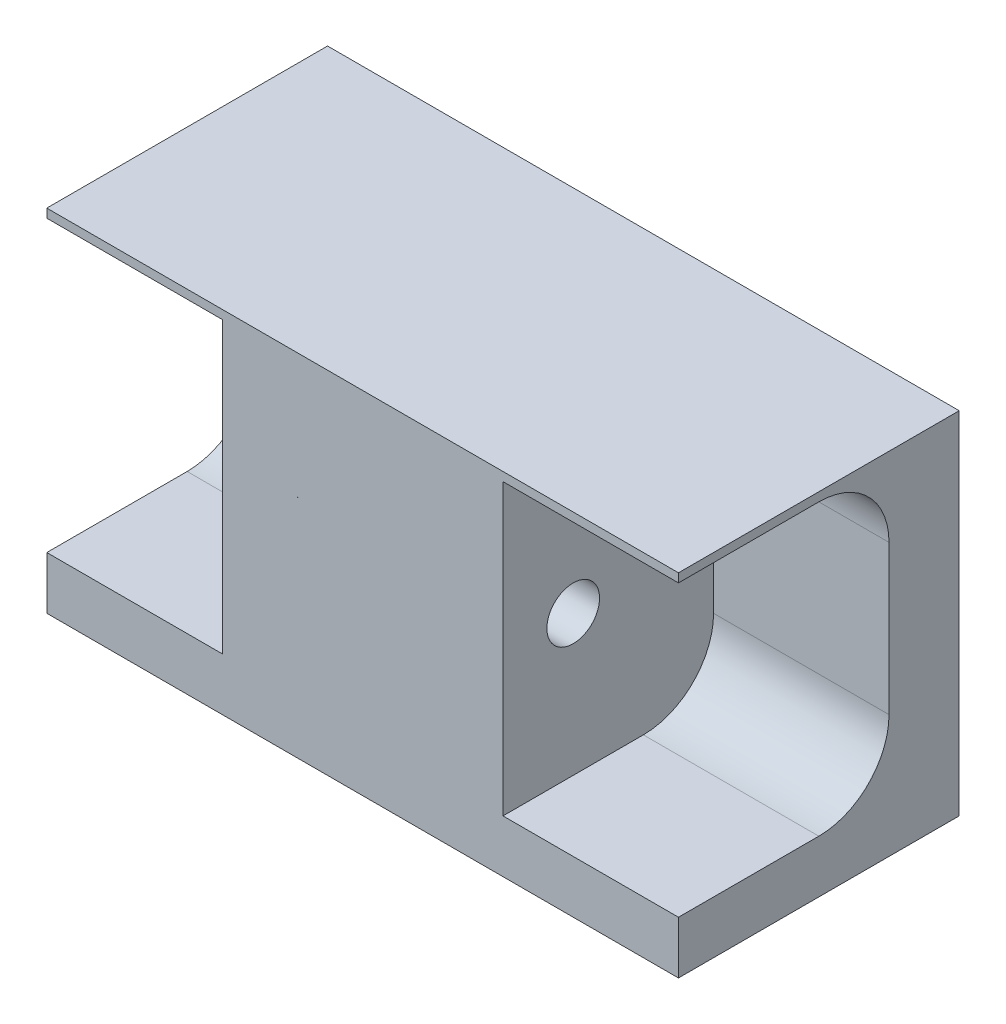
ISO-10303-21;
HEADER;
FILE_DESCRIPTION(('STEP AP214'),'2;1');
FILE_NAME('part.step','',(''),(''),'','','');
FILE_SCHEMA(('AUTOMOTIVE_DESIGN { 1 0 10303 214 1 1 1 1 }'));
ENDSEC;
DATA;
#1=APPLICATION_CONTEXT('core data for automotive mechanical design processes');
#2=APPLICATION_PROTOCOL_DEFINITION('international standard','automotive_design',2000,#1);
#3=PRODUCT_CONTEXT('',#1,'mechanical');
#4=PRODUCT('Part','Part','',(#3));
#5=PRODUCT_RELATED_PRODUCT_CATEGORY('part','',(#4));
#6=PRODUCT_DEFINITION_FORMATION('','',#4);
#7=PRODUCT_DEFINITION_CONTEXT('part definition',#1,'design');
#8=PRODUCT_DEFINITION('design','',#6,#7);
#9=PRODUCT_DEFINITION_SHAPE('','',#8);
#10=(LENGTH_UNIT() NAMED_UNIT(*) SI_UNIT(.MILLI.,.METRE.));
#11=(NAMED_UNIT(*) PLANE_ANGLE_UNIT() SI_UNIT($,.RADIAN.));
#12=(NAMED_UNIT(*) SI_UNIT($,.STERADIAN.) SOLID_ANGLE_UNIT());
#13=UNCERTAINTY_MEASURE_WITH_UNIT(LENGTH_MEASURE(1.E-05),#10,'distance_accuracy_value','');
#14=(GEOMETRIC_REPRESENTATION_CONTEXT(3) GLOBAL_UNCERTAINTY_ASSIGNED_CONTEXT((#13)) GLOBAL_UNIT_ASSIGNED_CONTEXT((#10,
#11,#12)) REPRESENTATION_CONTEXT('',''));
#15=CARTESIAN_POINT('',(0.,0.,0.));
#16=DIRECTION('',(0.,0.,1.));
#17=DIRECTION('',(1.,0.,0.));
#18=AXIS2_PLACEMENT_3D('',#15,#16,#17);
#19=CARTESIAN_POINT('',(114.3,127.,-101.6));
#20=DIRECTION('',(0.,0.,1.));
#21=DIRECTION('',(0.,-1.,0.));
#22=AXIS2_PLACEMENT_3D('',#19,#20,#21);
#23=PLANE('',#22);
#24=DIRECTION('',(-1.,0.,0.));
#25=VECTOR('',#24,1.);
#26=CARTESIAN_POINT('',(114.3,-127.,-101.6));
#27=LINE('',#26,#25);
#28=CARTESIAN_POINT('',(114.3,-127.,-101.6));
#29=VERTEX_POINT('',#28);
#30=CARTESIAN_POINT('',(-342.9,-127.,-101.6));
#31=VERTEX_POINT('',#30);
#32=EDGE_CURVE('E270',#29,#31,#27,.T.);
#33=ORIENTED_EDGE('',*,*,#32,.T.);
#34=DIRECTION('',(0.,1.,0.));
#35=VECTOR('',#34,1.);
#36=CARTESIAN_POINT('',(-342.9,127.,-101.6));
#37=LINE('',#36,#35);
#38=CARTESIAN_POINT('',(-342.9,127.,-101.6));
#39=VERTEX_POINT('',#38);
#40=EDGE_CURVE('E199',#31,#39,#37,.T.);
#41=ORIENTED_EDGE('',*,*,#40,.T.);
#42=DIRECTION('',(-1.,0.,0.));
#43=VECTOR('',#42,1.);
#44=CARTESIAN_POINT('',(114.3,127.,-101.6));
#45=LINE('',#44,#43);
#46=CARTESIAN_POINT('',(114.3,127.,-101.6));
#47=VERTEX_POINT('',#46);
#48=EDGE_CURVE('E11',#47,#39,#45,.T.);
#49=ORIENTED_EDGE('',*,*,#48,.F.);
#50=DIRECTION('',(0.,1.,0.));
#51=VECTOR('',#50,1.);
#52=CARTESIAN_POINT('',(114.3,127.,-101.6));
#53=LINE('',#52,#51);
#54=EDGE_CURVE('E252',#29,#47,#53,.T.);
#55=ORIENTED_EDGE('',*,*,#54,.F.);
#56=EDGE_LOOP('',(#33,#41,#49,#55));
#57=FACE_BOUND('',#56,.T.);
#58=ADVANCED_FACE('F34',(#57),#23,.F.);
#59=CARTESIAN_POINT('',(114.3,127.,101.6));
#60=DIRECTION('',(0.,-1.,0.));
#61=DIRECTION('',(0.,0.,-1.));
#62=AXIS2_PLACEMENT_3D('',#59,#60,#61);
#63=PLANE('',#62);
#64=ORIENTED_EDGE('',*,*,#48,.T.);
#65=DIRECTION('',(0.,0.,1.));
#66=VECTOR('',#65,1.);
#67=CARTESIAN_POINT('',(-342.9,127.,101.6));
#68=LINE('',#67,#66);
#69=CARTESIAN_POINT('',(-342.9,127.,101.6));
#70=VERTEX_POINT('',#69);
#71=EDGE_CURVE('E209',#39,#70,#68,.T.);
#72=ORIENTED_EDGE('',*,*,#71,.T.);
#73=DIRECTION('',(-1.,0.,0.));
#74=VECTOR('',#73,1.);
#75=CARTESIAN_POINT('',(114.3,127.,101.6));
#76=LINE('',#75,#74);
#77=CARTESIAN_POINT('',(114.3,127.,101.6));
#78=VERTEX_POINT('',#77);
#79=EDGE_CURVE('E42',#78,#70,#76,.T.);
#80=ORIENTED_EDGE('',*,*,#79,.F.);
#81=DIRECTION('',(0.,0.,1.));
#82=VECTOR('',#81,1.);
#83=CARTESIAN_POINT('',(114.3,127.,101.6));
#84=LINE('',#83,#82);
#85=EDGE_CURVE('E263',#47,#78,#84,.T.);
#86=ORIENTED_EDGE('',*,*,#85,.F.);
#87=EDGE_LOOP('',(#64,#72,#80,#86));
#88=FACE_BOUND('',#87,.T.);
#89=ADVANCED_FACE('F283',(#88),#63,.F.);
#90=CARTESIAN_POINT('',(114.3,127.,101.6));
#91=DIRECTION('',(0.,0.,-1.));
#92=DIRECTION('',(0.,1.,0.));
#93=AXIS2_PLACEMENT_3D('',#90,#91,#92);
#94=PLANE('',#93);
#95=DIRECTION('',(0.,-1.,0.));
#96=VECTOR('',#95,1.);
#97=CARTESIAN_POINT('',(-12.7,120.65,101.6));
#98=LINE('',#97,#96);
#99=CARTESIAN_POINT('',(-12.7,120.65,101.6));
#100=VERTEX_POINT('',#99);
#101=CARTESIAN_POINT('',(-12.7,-88.9,101.6));
#102=VERTEX_POINT('',#101);
#103=EDGE_CURVE('E219',#100,#102,#98,.T.);
#104=ORIENTED_EDGE('',*,*,#103,.F.);
#105=DIRECTION('',(1.,0.,0.));
#106=VECTOR('',#105,1.);
#107=CARTESIAN_POINT('',(-12.7,120.65,101.6));
#108=LINE('',#107,#106);
#109=CARTESIAN_POINT('',(114.3,120.65,101.6));
#110=VERTEX_POINT('',#109);
#111=EDGE_CURVE('E249',#100,#110,#108,.T.);
#112=ORIENTED_EDGE('',*,*,#111,.T.);
#113=DIRECTION('',(0.,-1.,0.));
#114=VECTOR('',#113,1.);
#115=CARTESIAN_POINT('',(114.3,127.,101.6));
#116=LINE('',#115,#114);
#117=EDGE_CURVE('E266',#78,#110,#116,.T.);
#118=ORIENTED_EDGE('',*,*,#117,.F.);
#119=ORIENTED_EDGE('',*,*,#79,.T.);
#120=DIRECTION('',(0.,-1.,0.));
#121=VECTOR('',#120,1.);
#122=CARTESIAN_POINT('',(-342.9,127.,101.6));
#123=LINE('',#122,#121);
#124=CARTESIAN_POINT('',(-342.9,120.65,101.6));
#125=VERTEX_POINT('',#124);
#126=EDGE_CURVE('E213',#70,#125,#123,.T.);
#127=ORIENTED_EDGE('',*,*,#126,.T.);
#128=DIRECTION('',(-1.,0.,0.));
#129=VECTOR('',#128,1.);
#130=CARTESIAN_POINT('',(-215.9,120.65,101.6));
#131=LINE('',#130,#129);
#132=CARTESIAN_POINT('',(-215.9,120.65,101.6));
#133=VERTEX_POINT('',#132);
#134=EDGE_CURVE('E175',#133,#125,#131,.T.);
#135=ORIENTED_EDGE('',*,*,#134,.F.);
#136=DIRECTION('',(0.,-1.,0.));
#137=VECTOR('',#136,1.);
#138=CARTESIAN_POINT('',(-215.9,120.65,101.6));
#139=LINE('',#138,#137);
#140=CARTESIAN_POINT('',(-215.9,-88.9,101.6));
#141=VERTEX_POINT('',#140);
#142=EDGE_CURVE('E153',#133,#141,#139,.T.);
#143=ORIENTED_EDGE('',*,*,#142,.T.);
#144=DIRECTION('',(-1.,0.,0.));
#145=VECTOR('',#144,1.);
#146=CARTESIAN_POINT('',(-215.9,-88.9,101.6));
#147=LINE('',#146,#145);
#148=CARTESIAN_POINT('',(-342.9,-88.9,101.6));
#149=VERTEX_POINT('',#148);
#150=EDGE_CURVE('E160',#141,#149,#147,.T.);
#151=ORIENTED_EDGE('',*,*,#150,.T.);
#152=CARTESIAN_POINT('',(-342.9,-127.,101.6));
#153=VERTEX_POINT('',#152);
#154=EDGE_CURVE('E212',#149,#153,#123,.T.);
#155=ORIENTED_EDGE('',*,*,#154,.T.);
#156=DIRECTION('',(-1.,0.,0.));
#157=VECTOR('',#156,1.);
#158=CARTESIAN_POINT('',(114.3,-127.,101.6));
#159=LINE('',#158,#157);
#160=CARTESIAN_POINT('',(114.3,-127.,101.6));
#161=VERTEX_POINT('',#160);
#162=EDGE_CURVE('E272',#161,#153,#159,.T.);
#163=ORIENTED_EDGE('',*,*,#162,.F.);
#164=CARTESIAN_POINT('',(114.3,-88.9,101.6));
#165=VERTEX_POINT('',#164);
#166=EDGE_CURVE('E265',#165,#161,#116,.T.);
#167=ORIENTED_EDGE('',*,*,#166,.F.);
#168=DIRECTION('',(1.,0.,0.));
#169=VECTOR('',#168,1.);
#170=CARTESIAN_POINT('',(-12.7,-88.9,101.6));
#171=LINE('',#170,#169);
#172=EDGE_CURVE('E49',#102,#165,#171,.T.);
#173=ORIENTED_EDGE('',*,*,#172,.F.);
#174=EDGE_LOOP('',(#104,#112,#118,#119,#127,#135,#143,#151,#155,#163,#167,#173));
#175=FACE_BOUND('',#174,.T.);
#176=ADVANCED_FACE('F172',(#175),#94,.F.);
#177=CARTESIAN_POINT('',(114.3,-127.,101.6));
#178=DIRECTION('',(0.,1.,0.));
#179=DIRECTION('',(0.,0.,1.));
#180=AXIS2_PLACEMENT_3D('',#177,#178,#179);
#181=PLANE('',#180);
#182=ORIENTED_EDGE('',*,*,#162,.T.);
#183=DIRECTION('',(0.,0.,-1.));
#184=VECTOR('',#183,1.);
#185=CARTESIAN_POINT('',(-342.9,-127.,101.6));
#186=LINE('',#185,#184);
#187=EDGE_CURVE('E215',#153,#31,#186,.T.);
#188=ORIENTED_EDGE('',*,*,#187,.T.);
#189=ORIENTED_EDGE('',*,*,#32,.F.);
#190=DIRECTION('',(0.,0.,-1.));
#191=VECTOR('',#190,1.);
#192=CARTESIAN_POINT('',(114.3,-127.,101.6));
#193=LINE('',#192,#191);
#194=EDGE_CURVE('E57',#161,#29,#193,.T.);
#195=ORIENTED_EDGE('',*,*,#194,.F.);
#196=EDGE_LOOP('',(#182,#188,#189,#195));
#197=FACE_BOUND('',#196,.T.);
#198=ADVANCED_FACE('F291',(#197),#181,.F.);
#199=CARTESIAN_POINT('',(114.3,0.,0.));
#200=DIRECTION('',(1.,0.,0.));
#201=DIRECTION('',(0.,0.,-1.));
#202=AXIS2_PLACEMENT_3D('',#199,#200,#201);
#203=PLANE('',#202);
#204=DIRECTION('',(0.,0.,1.));
#205=VECTOR('',#204,1.);
#206=CARTESIAN_POINT('',(114.3,120.65,101.6));
#207=LINE('',#206,#205);
#208=CARTESIAN_POINT('',(114.3,120.65,3.40005801291454E-13));
#209=VERTEX_POINT('',#208);
#210=EDGE_CURVE('E223',#209,#110,#207,.T.);
#211=ORIENTED_EDGE('',*,*,#210,.F.);
#212=CARTESIAN_POINT('',(114.3,69.85,0.));
#213=DIRECTION('',(1.,0.,0.));
#214=DIRECTION('',(0.,0.,1.));
#215=AXIS2_PLACEMENT_3D('',#212,#213,#214);
#216=CIRCLE('',#215,50.8);
#217=CARTESIAN_POINT('',(114.3,69.8499999999997,-50.8));
#218=VERTEX_POINT('',#217);
#219=EDGE_CURVE('E245',#218,#209,#216,.T.);
#220=ORIENTED_EDGE('',*,*,#219,.F.);
#221=DIRECTION('',(0.,1.,0.));
#222=VECTOR('',#221,1.);
#223=CARTESIAN_POINT('',(114.3,69.8499999999997,-50.8));
#224=LINE('',#223,#222);
#225=CARTESIAN_POINT('',(114.3,-38.0999999999997,-50.8));
#226=VERTEX_POINT('',#225);
#227=EDGE_CURVE('E242',#226,#218,#224,.T.);
#228=ORIENTED_EDGE('',*,*,#227,.F.);
#229=CARTESIAN_POINT('',(114.3,-38.1,0.));
#230=DIRECTION('',(1.,0.,0.));
#231=DIRECTION('',(0.,0.,1.));
#232=AXIS2_PLACEMENT_3D('',#229,#230,#231);
#233=CIRCLE('',#232,50.8);
#234=CARTESIAN_POINT('',(114.3,-88.9,3.37746113348814E-13));
#235=VERTEX_POINT('',#234);
#236=EDGE_CURVE('E239',#235,#226,#233,.T.);
#237=ORIENTED_EDGE('',*,*,#236,.F.);
#238=DIRECTION('',(0.,0.,-1.));
#239=VECTOR('',#238,1.);
#240=CARTESIAN_POINT('',(114.3,-88.9,3.33066907387547E-13));
#241=LINE('',#240,#239);
#242=EDGE_CURVE('E218',#165,#235,#241,.T.);
#243=ORIENTED_EDGE('',*,*,#242,.F.);
#244=ORIENTED_EDGE('',*,*,#166,.T.);
#245=ORIENTED_EDGE('',*,*,#194,.T.);
#246=ORIENTED_EDGE('',*,*,#54,.T.);
#247=ORIENTED_EDGE('',*,*,#85,.T.);
#248=ORIENTED_EDGE('',*,*,#117,.T.);
#249=EDGE_LOOP('',(#211,#220,#228,#237,#243,#244,#245,#246,#247,#248));
#250=FACE_BOUND('',#249,.T.);
#251=ADVANCED_FACE('F293',(#250),#203,.T.);
#252=CARTESIAN_POINT('',(-12.7,120.65,101.6));
#253=DIRECTION('',(0.,1.,0.));
#254=DIRECTION('',(0.,0.,1.));
#255=AXIS2_PLACEMENT_3D('',#252,#253,#254);
#256=PLANE('',#255);
#257=ORIENTED_EDGE('',*,*,#210,.T.);
#258=ORIENTED_EDGE('',*,*,#111,.F.);
#259=DIRECTION('',(0.,0.,1.));
#260=VECTOR('',#259,1.);
#261=CARTESIAN_POINT('',(-12.7,120.65,101.6));
#262=LINE('',#261,#260);
#263=CARTESIAN_POINT('',(-12.7,120.65,3.40005801291454E-13));
#264=VERTEX_POINT('',#263);
#265=EDGE_CURVE('E235',#264,#100,#262,.T.);
#266=ORIENTED_EDGE('',*,*,#265,.F.);
#267=DIRECTION('',(1.,0.,0.));
#268=VECTOR('',#267,1.);
#269=CARTESIAN_POINT('',(-12.7,120.65,3.40005801291454E-13));
#270=LINE('',#269,#268);
#271=EDGE_CURVE('E253',#264,#209,#270,.T.);
#272=ORIENTED_EDGE('',*,*,#271,.T.);
#273=EDGE_LOOP('',(#257,#258,#266,#272));
#274=FACE_BOUND('',#273,.T.);
#275=ADVANCED_FACE('F299',(#274),#256,.F.);
#276=CARTESIAN_POINT('',(-12.7,69.85,0.));
#277=DIRECTION('',(1.,0.,0.));
#278=DIRECTION('',(0.,0.,-1.));
#279=AXIS2_PLACEMENT_3D('',#276,#277,#278);
#280=CYLINDRICAL_SURFACE('',#279,50.8);
#281=ORIENTED_EDGE('',*,*,#219,.T.);
#282=ORIENTED_EDGE('',*,*,#271,.F.);
#283=CARTESIAN_POINT('',(-12.7,69.85,0.));
#284=DIRECTION('',(1.,0.,0.));
#285=DIRECTION('',(0.,0.,1.));
#286=AXIS2_PLACEMENT_3D('',#283,#284,#285);
#287=CIRCLE('',#286,50.8);
#288=CARTESIAN_POINT('',(-12.7,69.8499999999997,-50.8));
#289=VERTEX_POINT('',#288);
#290=EDGE_CURVE('E232',#289,#264,#287,.T.);
#291=ORIENTED_EDGE('',*,*,#290,.F.);
#292=DIRECTION('',(1.,0.,0.));
#293=VECTOR('',#292,1.);
#294=CARTESIAN_POINT('',(-12.7,69.8499999999997,-50.8));
#295=LINE('',#294,#293);
#296=EDGE_CURVE('E255',#289,#218,#295,.T.);
#297=ORIENTED_EDGE('',*,*,#296,.T.);
#298=EDGE_LOOP('',(#281,#282,#291,#297));
#299=FACE_BOUND('',#298,.T.);
#300=ADVANCED_FACE('F416',(#299),#280,.F.);
#301=CARTESIAN_POINT('',(-12.7,69.8499999999997,-50.8));
#302=DIRECTION('',(0.,0.,-1.));
#303=DIRECTION('',(0.,1.,0.));
#304=AXIS2_PLACEMENT_3D('',#301,#302,#303);
#305=PLANE('',#304);
#306=ORIENTED_EDGE('',*,*,#227,.T.);
#307=ORIENTED_EDGE('',*,*,#296,.F.);
#308=DIRECTION('',(0.,1.,0.));
#309=VECTOR('',#308,1.);
#310=CARTESIAN_POINT('',(-12.7,69.8499999999997,-50.8));
#311=LINE('',#310,#309);
#312=CARTESIAN_POINT('',(-12.7,-38.0999999999997,-50.8));
#313=VERTEX_POINT('',#312);
#314=EDGE_CURVE('E229',#313,#289,#311,.T.);
#315=ORIENTED_EDGE('',*,*,#314,.F.);
#316=DIRECTION('',(1.,0.,0.));
#317=VECTOR('',#316,1.);
#318=CARTESIAN_POINT('',(-12.7,-38.0999999999997,-50.8));
#319=LINE('',#318,#317);
#320=EDGE_CURVE('E257',#313,#226,#319,.T.);
#321=ORIENTED_EDGE('',*,*,#320,.T.);
#322=EDGE_LOOP('',(#306,#307,#315,#321));
#323=FACE_BOUND('',#322,.T.);
#324=ADVANCED_FACE('F420',(#323),#305,.F.);
#325=CARTESIAN_POINT('',(-12.7,-38.1,0.));
#326=DIRECTION('',(1.,0.,0.));
#327=DIRECTION('',(0.,0.,-1.));
#328=AXIS2_PLACEMENT_3D('',#325,#326,#327);
#329=CYLINDRICAL_SURFACE('',#328,50.8);
#330=ORIENTED_EDGE('',*,*,#236,.T.);
#331=ORIENTED_EDGE('',*,*,#320,.F.);
#332=CARTESIAN_POINT('',(-12.7,-38.1,0.));
#333=DIRECTION('',(1.,0.,0.));
#334=DIRECTION('',(0.,0.,1.));
#335=AXIS2_PLACEMENT_3D('',#332,#333,#334);
#336=CIRCLE('',#335,50.8);
#337=CARTESIAN_POINT('',(-12.7,-88.9,3.37746113348814E-13));
#338=VERTEX_POINT('',#337);
#339=EDGE_CURVE('E226',#338,#313,#336,.T.);
#340=ORIENTED_EDGE('',*,*,#339,.F.);
#341=DIRECTION('',(1.,0.,0.));
#342=VECTOR('',#341,1.);
#343=CARTESIAN_POINT('',(-12.7,-88.9,3.37746113348814E-13));
#344=LINE('',#343,#342);
#345=EDGE_CURVE('E259',#338,#235,#344,.T.);
#346=ORIENTED_EDGE('',*,*,#345,.T.);
#347=EDGE_LOOP('',(#330,#331,#340,#346));
#348=FACE_BOUND('',#347,.T.);
#349=ADVANCED_FACE('F424',(#348),#329,.F.);
#350=CARTESIAN_POINT('',(-12.7,-88.9,3.33066907387547E-13));
#351=DIRECTION('',(0.,-1.,0.));
#352=DIRECTION('',(0.,0.,-1.));
#353=AXIS2_PLACEMENT_3D('',#350,#351,#352);
#354=PLANE('',#353);
#355=ORIENTED_EDGE('',*,*,#242,.T.);
#356=ORIENTED_EDGE('',*,*,#345,.F.);
#357=DIRECTION('',(0.,0.,-1.));
#358=VECTOR('',#357,1.);
#359=CARTESIAN_POINT('',(-12.7,-88.9,3.33066907387547E-13));
#360=LINE('',#359,#358);
#361=EDGE_CURVE('E222',#102,#338,#360,.T.);
#362=ORIENTED_EDGE('',*,*,#361,.F.);
#363=ORIENTED_EDGE('',*,*,#172,.T.);
#364=EDGE_LOOP('',(#355,#356,#362,#363));
#365=FACE_BOUND('',#364,.T.);
#366=ADVANCED_FACE('F386',(#365),#354,.F.);
#367=CARTESIAN_POINT('',(-12.7,-38.1,0.));
#368=DIRECTION('',(-1.,0.,0.));
#369=DIRECTION('',(0.,0.,1.));
#370=AXIS2_PLACEMENT_3D('',#367,#368,#369);
#371=PLANE('',#370);
#372=CARTESIAN_POINT('',(-12.7,12.7,50.8));
#373=DIRECTION('',(-1.,0.,0.));
#374=DIRECTION('',(0.,0.,1.));
#375=AXIS2_PLACEMENT_3D('',#372,#373,#374);
#376=CIRCLE('',#375,19.05);
#377=CARTESIAN_POINT('',(-12.7,12.7,69.85));
#378=VERTEX_POINT('',#377);
#379=EDGE_CURVE('E181',#378,#378,#376,.T.);
#380=ORIENTED_EDGE('',*,*,#379,.T.);
#381=EDGE_LOOP('',(#380));
#382=FACE_BOUND('',#381,.T.);
#383=ORIENTED_EDGE('',*,*,#103,.T.);
#384=ORIENTED_EDGE('',*,*,#361,.T.);
#385=ORIENTED_EDGE('',*,*,#339,.T.);
#386=ORIENTED_EDGE('',*,*,#314,.T.);
#387=ORIENTED_EDGE('',*,*,#290,.T.);
#388=ORIENTED_EDGE('',*,*,#265,.T.);
#389=EDGE_LOOP('',(#383,#384,#385,#386,#387,#388));
#390=FACE_BOUND('',#389,.T.);
#391=ADVANCED_FACE('F328',(#382,#390),#371,.F.);
#392=CARTESIAN_POINT('',(-342.9,0.,0.));
#393=DIRECTION('',(-1.,0.,0.));
#394=DIRECTION('',(0.,0.,-1.));
#395=AXIS2_PLACEMENT_3D('',#392,#393,#394);
#396=PLANE('',#395);
#397=DIRECTION('',(0.,0.,1.));
#398=VECTOR('',#397,1.);
#399=CARTESIAN_POINT('',(-342.9,120.65,101.6));
#400=LINE('',#399,#398);
#401=CARTESIAN_POINT('',(-342.9,120.65,3.40005801291454E-13));
#402=VERTEX_POINT('',#401);
#403=EDGE_CURVE('E176',#402,#125,#400,.T.);
#404=ORIENTED_EDGE('',*,*,#403,.T.);
#405=ORIENTED_EDGE('',*,*,#126,.F.);
#406=ORIENTED_EDGE('',*,*,#71,.F.);
#407=ORIENTED_EDGE('',*,*,#40,.F.);
#408=ORIENTED_EDGE('',*,*,#187,.F.);
#409=ORIENTED_EDGE('',*,*,#154,.F.);
#410=DIRECTION('',(0.,0.,-1.));
#411=VECTOR('',#410,1.);
#412=CARTESIAN_POINT('',(-342.9,-88.9,3.33066907387547E-13));
#413=LINE('',#412,#411);
#414=CARTESIAN_POINT('',(-342.9,-88.9,3.37746113348814E-13));
#415=VERTEX_POINT('',#414);
#416=EDGE_CURVE('E163',#149,#415,#413,.T.);
#417=ORIENTED_EDGE('',*,*,#416,.T.);
#418=CARTESIAN_POINT('',(-342.9,-38.1,0.));
#419=DIRECTION('',(1.,0.,0.));
#420=DIRECTION('',(0.,0.,1.));
#421=AXIS2_PLACEMENT_3D('',#418,#419,#420);
#422=CIRCLE('',#421,50.8);
#423=CARTESIAN_POINT('',(-342.9,-38.0999999999997,-50.8));
#424=VERTEX_POINT('',#423);
#425=EDGE_CURVE('E190',#415,#424,#422,.T.);
#426=ORIENTED_EDGE('',*,*,#425,.T.);
#427=DIRECTION('',(0.,1.,0.));
#428=VECTOR('',#427,1.);
#429=CARTESIAN_POINT('',(-342.9,69.8499999999997,-50.8));
#430=LINE('',#429,#428);
#431=CARTESIAN_POINT('',(-342.9,69.8499999999997,-50.8));
#432=VERTEX_POINT('',#431);
#433=EDGE_CURVE('E193',#424,#432,#430,.T.);
#434=ORIENTED_EDGE('',*,*,#433,.T.);
#435=CARTESIAN_POINT('',(-342.9,69.85,0.));
#436=DIRECTION('',(1.,0.,0.));
#437=DIRECTION('',(0.,0.,1.));
#438=AXIS2_PLACEMENT_3D('',#435,#436,#437);
#439=CIRCLE('',#438,50.8);
#440=EDGE_CURVE('E178',#432,#402,#439,.T.);
#441=ORIENTED_EDGE('',*,*,#440,.T.);
#442=EDGE_LOOP('',(#404,#405,#406,#407,#408,#409,#417,#426,#434,#441));
#443=FACE_BOUND('',#442,.T.);
#444=ADVANCED_FACE('F280',(#443),#396,.T.);
#445=CARTESIAN_POINT('',(-215.9,120.65,101.6));
#446=DIRECTION('',(0.,1.,0.));
#447=DIRECTION('',(0.,0.,1.));
#448=AXIS2_PLACEMENT_3D('',#445,#446,#447);
#449=PLANE('',#448);
#450=ORIENTED_EDGE('',*,*,#403,.F.);
#451=DIRECTION('',(-1.,0.,0.));
#452=VECTOR('',#451,1.);
#453=CARTESIAN_POINT('',(-215.9,120.65,3.40005801291454E-13));
#454=LINE('',#453,#452);
#455=CARTESIAN_POINT('',(-215.9,120.65,3.40005801291454E-13));
#456=VERTEX_POINT('',#455);
#457=EDGE_CURVE('E200',#456,#402,#454,.T.);
#458=ORIENTED_EDGE('',*,*,#457,.F.);
#459=DIRECTION('',(0.,0.,1.));
#460=VECTOR('',#459,1.);
#461=CARTESIAN_POINT('',(-215.9,120.65,101.6));
#462=LINE('',#461,#460);
#463=EDGE_CURVE('E168',#456,#133,#462,.T.);
#464=ORIENTED_EDGE('',*,*,#463,.T.);
#465=ORIENTED_EDGE('',*,*,#134,.T.);
#466=EDGE_LOOP('',(#450,#458,#464,#465));
#467=FACE_BOUND('',#466,.T.);
#468=ADVANCED_FACE('F327',(#467),#449,.F.);
#469=CARTESIAN_POINT('',(-215.9,69.85,0.));
#470=DIRECTION('',(-1.,0.,0.));
#471=DIRECTION('',(0.,0.,-1.));
#472=AXIS2_PLACEMENT_3D('',#469,#470,#471);
#473=CYLINDRICAL_SURFACE('',#472,50.8);
#474=ORIENTED_EDGE('',*,*,#440,.F.);
#475=DIRECTION('',(-1.,0.,0.));
#476=VECTOR('',#475,1.);
#477=CARTESIAN_POINT('',(-215.9,69.8499999999997,-50.8));
#478=LINE('',#477,#476);
#479=CARTESIAN_POINT('',(-215.9,69.8499999999997,-50.8));
#480=VERTEX_POINT('',#479);
#481=EDGE_CURVE('E202',#480,#432,#478,.T.);
#482=ORIENTED_EDGE('',*,*,#481,.F.);
#483=CARTESIAN_POINT('',(-215.9,69.85,0.));
#484=DIRECTION('',(1.,0.,0.));
#485=DIRECTION('',(0.,0.,1.));
#486=AXIS2_PLACEMENT_3D('',#483,#484,#485);
#487=CIRCLE('',#486,50.8);
#488=EDGE_CURVE('E186',#480,#456,#487,.T.);
#489=ORIENTED_EDGE('',*,*,#488,.T.);
#490=ORIENTED_EDGE('',*,*,#457,.T.);
#491=EDGE_LOOP('',(#474,#482,#489,#490));
#492=FACE_BOUND('',#491,.T.);
#493=ADVANCED_FACE('F338',(#492),#473,.F.);
#494=CARTESIAN_POINT('',(-215.9,69.8499999999997,-50.8));
#495=DIRECTION('',(0.,0.,-1.));
#496=DIRECTION('',(0.,1.,0.));
#497=AXIS2_PLACEMENT_3D('',#494,#495,#496);
#498=PLANE('',#497);
#499=ORIENTED_EDGE('',*,*,#433,.F.);
#500=DIRECTION('',(-1.,0.,0.));
#501=VECTOR('',#500,1.);
#502=CARTESIAN_POINT('',(-215.9,-38.0999999999997,-50.8));
#503=LINE('',#502,#501);
#504=CARTESIAN_POINT('',(-215.9,-38.0999999999997,-50.8));
#505=VERTEX_POINT('',#504);
#506=EDGE_CURVE('E204',#505,#424,#503,.T.);
#507=ORIENTED_EDGE('',*,*,#506,.F.);
#508=DIRECTION('',(0.,1.,0.));
#509=VECTOR('',#508,1.);
#510=CARTESIAN_POINT('',(-215.9,69.8499999999997,-50.8));
#511=LINE('',#510,#509);
#512=EDGE_CURVE('E184',#505,#480,#511,.T.);
#513=ORIENTED_EDGE('',*,*,#512,.T.);
#514=ORIENTED_EDGE('',*,*,#481,.T.);
#515=EDGE_LOOP('',(#499,#507,#513,#514));
#516=FACE_BOUND('',#515,.T.);
#517=ADVANCED_FACE('F348',(#516),#498,.F.);
#518=CARTESIAN_POINT('',(-215.9,-38.1,0.));
#519=DIRECTION('',(-1.,0.,0.));
#520=DIRECTION('',(0.,0.,-1.));
#521=AXIS2_PLACEMENT_3D('',#518,#519,#520);
#522=CYLINDRICAL_SURFACE('',#521,50.8);
#523=ORIENTED_EDGE('',*,*,#425,.F.);
#524=DIRECTION('',(-1.,0.,0.));
#525=VECTOR('',#524,1.);
#526=CARTESIAN_POINT('',(-215.9,-88.9,3.37746113348814E-13));
#527=LINE('',#526,#525);
#528=CARTESIAN_POINT('',(-215.9,-88.9,3.37746113348814E-13));
#529=VERTEX_POINT('',#528);
#530=EDGE_CURVE('E167',#529,#415,#527,.T.);
#531=ORIENTED_EDGE('',*,*,#530,.F.);
#532=CARTESIAN_POINT('',(-215.9,-38.1,0.));
#533=DIRECTION('',(1.,0.,0.));
#534=DIRECTION('',(0.,0.,1.));
#535=AXIS2_PLACEMENT_3D('',#532,#533,#534);
#536=CIRCLE('',#535,50.8);
#537=EDGE_CURVE('E155',#529,#505,#536,.T.);
#538=ORIENTED_EDGE('',*,*,#537,.T.);
#539=ORIENTED_EDGE('',*,*,#506,.T.);
#540=EDGE_LOOP('',(#523,#531,#538,#539));
#541=FACE_BOUND('',#540,.T.);
#542=ADVANCED_FACE('F358',(#541),#522,.F.);
#543=CARTESIAN_POINT('',(-215.9,-88.9,3.33066907387547E-13));
#544=DIRECTION('',(0.,-1.,0.));
#545=DIRECTION('',(0.,0.,-1.));
#546=AXIS2_PLACEMENT_3D('',#543,#544,#545);
#547=PLANE('',#546);
#548=ORIENTED_EDGE('',*,*,#416,.F.);
#549=ORIENTED_EDGE('',*,*,#150,.F.);
#550=DIRECTION('',(0.,0.,-1.));
#551=VECTOR('',#550,1.);
#552=CARTESIAN_POINT('',(-215.9,-88.9,3.33066907387547E-13));
#553=LINE('',#552,#551);
#554=EDGE_CURVE('E148',#141,#529,#553,.T.);
#555=ORIENTED_EDGE('',*,*,#554,.T.);
#556=ORIENTED_EDGE('',*,*,#530,.T.);
#557=EDGE_LOOP('',(#548,#549,#555,#556));
#558=FACE_BOUND('',#557,.T.);
#559=ADVANCED_FACE('F161',(#558),#547,.F.);
#560=CARTESIAN_POINT('',(-215.9,-38.1,0.));
#561=DIRECTION('',(1.,0.,0.));
#562=DIRECTION('',(0.,0.,1.));
#563=AXIS2_PLACEMENT_3D('',#560,#561,#562);
#564=PLANE('',#563);
#565=CARTESIAN_POINT('',(-215.9,12.7,50.8));
#566=DIRECTION('',(1.,0.,0.));
#567=DIRECTION('',(0.,0.,-1.));
#568=AXIS2_PLACEMENT_3D('',#565,#566,#567);
#569=CIRCLE('',#568,19.05);
#570=CARTESIAN_POINT('',(-215.9,12.7,31.75));
#571=VERTEX_POINT('',#570);
#572=EDGE_CURVE('E37',#571,#571,#569,.T.);
#573=ORIENTED_EDGE('',*,*,#572,.T.);
#574=EDGE_LOOP('',(#573));
#575=FACE_BOUND('',#574,.T.);
#576=ORIENTED_EDGE('',*,*,#142,.F.);
#577=ORIENTED_EDGE('',*,*,#463,.F.);
#578=ORIENTED_EDGE('',*,*,#488,.F.);
#579=ORIENTED_EDGE('',*,*,#512,.F.);
#580=ORIENTED_EDGE('',*,*,#537,.F.);
#581=ORIENTED_EDGE('',*,*,#554,.F.);
#582=EDGE_LOOP('',(#576,#577,#578,#579,#580,#581));
#583=FACE_BOUND('',#582,.T.);
#584=ADVANCED_FACE('F150',(#575,#583),#564,.F.);
#585=CARTESIAN_POINT('',(-342.9,12.7,50.8));
#586=DIRECTION('',(1.,0.,0.));
#587=DIRECTION('',(0.,0.,-1.));
#588=AXIS2_PLACEMENT_3D('',#585,#586,#587);
#589=CYLINDRICAL_SURFACE('',#588,19.05);
#590=ORIENTED_EDGE('',*,*,#572,.F.);
#591=EDGE_LOOP('',(#590));
#592=FACE_BOUND('',#591,.T.);
#593=ORIENTED_EDGE('',*,*,#379,.F.);
#594=EDGE_LOOP('',(#593));
#595=FACE_BOUND('',#594,.T.);
#596=ADVANCED_FACE('F397',(#592,#595),#589,.F.);
#597=CLOSED_SHELL('',(#58,#89,#176,#198,#251,#275,#300,#324,#349,#366,#391,#444,#468,#493,#517,
#542,#559,#584,#596));
#598=MANIFOLD_SOLID_BREP('B2',#597);
#599=ADVANCED_BREP_SHAPE_REPRESENTATION('',(#18,#598),#14);
#600=SHAPE_DEFINITION_REPRESENTATION(#9,#599);
ENDSEC;
END-ISO-10303-21;
